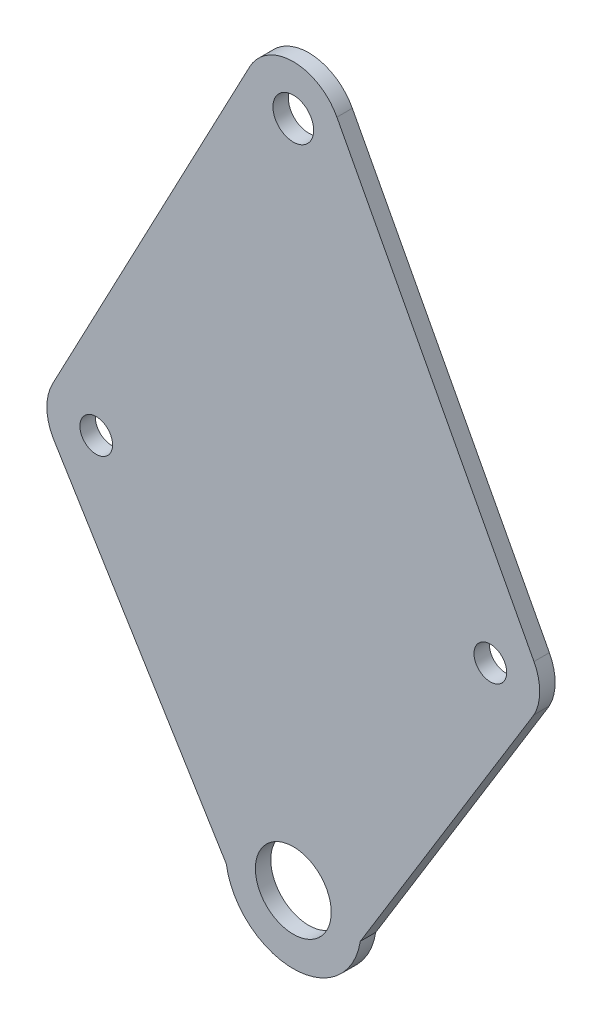
ISO-10303-21;
HEADER;
FILE_DESCRIPTION(('STEP AP214'),'2;1');
FILE_NAME('part.step','',(''),(''),'','','');
FILE_SCHEMA(('AUTOMOTIVE_DESIGN { 1 0 10303 214 1 1 1 1 }'));
ENDSEC;
DATA;
#1=APPLICATION_CONTEXT('core data for automotive mechanical design processes');
#2=APPLICATION_PROTOCOL_DEFINITION('international standard','automotive_design',2000,#1);
#3=PRODUCT_CONTEXT('',#1,'mechanical');
#4=PRODUCT('Part','Part','',(#3));
#5=PRODUCT_RELATED_PRODUCT_CATEGORY('part','',(#4));
#6=PRODUCT_DEFINITION_FORMATION('','',#4);
#7=PRODUCT_DEFINITION_CONTEXT('part definition',#1,'design');
#8=PRODUCT_DEFINITION('design','',#6,#7);
#9=PRODUCT_DEFINITION_SHAPE('','',#8);
#10=(LENGTH_UNIT() NAMED_UNIT(*) SI_UNIT(.MILLI.,.METRE.));
#11=(NAMED_UNIT(*) PLANE_ANGLE_UNIT() SI_UNIT($,.RADIAN.));
#12=(NAMED_UNIT(*) SI_UNIT($,.STERADIAN.) SOLID_ANGLE_UNIT());
#13=UNCERTAINTY_MEASURE_WITH_UNIT(LENGTH_MEASURE(1.E-05),#10,'distance_accuracy_value','');
#14=(GEOMETRIC_REPRESENTATION_CONTEXT(3) GLOBAL_UNCERTAINTY_ASSIGNED_CONTEXT((#13)) GLOBAL_UNIT_ASSIGNED_CONTEXT((#10,
#11,#12)) REPRESENTATION_CONTEXT('',''));
#15=CARTESIAN_POINT('',(0.,0.,0.));
#16=DIRECTION('',(0.,0.,1.));
#17=DIRECTION('',(1.,0.,0.));
#18=AXIS2_PLACEMENT_3D('',#15,#16,#17);
#19=CARTESIAN_POINT('',(65.848504693527,34.7933582987225,3.175));
#20=DIRECTION('',(0.884163052156837,0.467178442568475,0.));
#21=DIRECTION('',(-0.467178442568475,0.884163052156837,0.));
#22=AXIS2_PLACEMENT_3D('',#19,#20,#21);
#23=PLANE('',#22);
#24=DIRECTION('',(0.467178442568475,-0.884163052156838,0.));
#25=VECTOR('',#24,1.);
#26=CARTESIAN_POINT('',(65.848504693527,34.7933582987225,0.));
#27=LINE('',#26,#25);
#28=CARTESIAN_POINT('',(8.98309660991346,142.414532976496,0.));
#29=VERTEX_POINT('',#28);
#30=CARTESIAN_POINT('',(49.5659535589517,65.6090569617355,0.));
#31=VERTEX_POINT('',#30);
#32=EDGE_CURVE('E164',#29,#31,#27,.T.);
#33=ORIENTED_EDGE('',*,*,#32,.F.);
#34=DIRECTION('',(0.,0.,-1.));
#35=VECTOR('',#34,1.);
#36=CARTESIAN_POINT('',(8.98309660991346,142.414532976496,3.175));
#37=LINE('',#36,#35);
#38=CARTESIAN_POINT('',(8.98309660991346,142.414532976496,3.175));
#39=VERTEX_POINT('',#38);
#40=EDGE_CURVE('E11',#39,#29,#37,.T.);
#41=ORIENTED_EDGE('',*,*,#40,.F.);
#42=DIRECTION('',(0.467178442568475,-0.884163052156838,0.));
#43=VECTOR('',#42,1.);
#44=CARTESIAN_POINT('',(65.848504693527,34.7933582987225,3.175));
#45=LINE('',#44,#43);
#46=CARTESIAN_POINT('',(49.5659535589517,65.6090569617355,3.175));
#47=VERTEX_POINT('',#46);
#48=EDGE_CURVE('E205',#39,#47,#45,.T.);
#49=ORIENTED_EDGE('',*,*,#48,.T.);
#50=DIRECTION('',(0.,0.,-1.));
#51=VECTOR('',#50,1.);
#52=CARTESIAN_POINT('',(49.5659535589517,65.6090569617355,3.175));
#53=LINE('',#52,#51);
#54=EDGE_CURVE('E66',#47,#31,#53,.T.);
#55=ORIENTED_EDGE('',*,*,#54,.T.);
#56=EDGE_LOOP('',(#33,#41,#49,#55));
#57=FACE_BOUND('',#56,.T.);
#58=ADVANCED_FACE('F49',(#57),#23,.T.);
#59=CARTESIAN_POINT('',(0.,137.668,3.175));
#60=DIRECTION('',(0.,0.,-1.));
#61=DIRECTION('',(-1.,0.,0.));
#62=AXIS2_PLACEMENT_3D('',#59,#60,#61);
#63=CYLINDRICAL_SURFACE('',#62,10.16);
#64=CARTESIAN_POINT('',(0.,137.668,0.));
#65=DIRECTION('',(0.,0.,1.));
#66=DIRECTION('',(1.,0.,0.));
#67=AXIS2_PLACEMENT_3D('',#64,#65,#66);
#68=CIRCLE('',#67,10.16);
#69=CARTESIAN_POINT('',(-8.98309660991346,142.414532976496,0.));
#70=VERTEX_POINT('',#69);
#71=EDGE_CURVE('E167',#29,#70,#68,.T.);
#72=ORIENTED_EDGE('',*,*,#71,.T.);
#73=DIRECTION('',(0.,0.,-1.));
#74=VECTOR('',#73,1.);
#75=CARTESIAN_POINT('',(-8.98309660991346,142.414532976496,3.175));
#76=LINE('',#75,#74);
#77=CARTESIAN_POINT('',(-8.98309660991346,142.414532976496,3.175));
#78=VERTEX_POINT('',#77);
#79=EDGE_CURVE('E58',#78,#70,#76,.T.);
#80=ORIENTED_EDGE('',*,*,#79,.F.);
#81=CARTESIAN_POINT('',(0.,137.668,3.175));
#82=DIRECTION('',(0.,0.,1.));
#83=DIRECTION('',(1.,0.,0.));
#84=AXIS2_PLACEMENT_3D('',#81,#82,#83);
#85=CIRCLE('',#84,10.16);
#86=EDGE_CURVE('E248',#39,#78,#85,.T.);
#87=ORIENTED_EDGE('',*,*,#86,.F.);
#88=ORIENTED_EDGE('',*,*,#40,.T.);
#89=EDGE_LOOP('',(#72,#80,#87,#88));
#90=FACE_BOUND('',#89,.T.);
#91=ADVANCED_FACE('F268',(#90),#63,.T.);
#92=CARTESIAN_POINT('',(-65.848504693527,34.7933582987225,3.175));
#93=DIRECTION('',(0.884163052156837,-0.467178442568475,0.));
#94=DIRECTION('',(0.467178442568475,0.884163052156837,0.));
#95=AXIS2_PLACEMENT_3D('',#92,#93,#94);
#96=PLANE('',#95);
#97=DIRECTION('',(-0.467178442568475,-0.884163052156838,0.));
#98=VECTOR('',#97,1.);
#99=CARTESIAN_POINT('',(-65.848504693527,34.7933582987225,0.));
#100=LINE('',#99,#98);
#101=CARTESIAN_POINT('',(-49.5659535589517,65.6090569617355,0.));
#102=VERTEX_POINT('',#101);
#103=EDGE_CURVE('E170',#70,#102,#100,.T.);
#104=ORIENTED_EDGE('',*,*,#103,.T.);
#105=DIRECTION('',(0.,0.,-1.));
#106=VECTOR('',#105,1.);
#107=CARTESIAN_POINT('',(-49.5659535589517,65.6090569617355,3.175));
#108=LINE('',#107,#106);
#109=CARTESIAN_POINT('',(-49.5659535589517,65.6090569617355,3.175));
#110=VERTEX_POINT('',#109);
#111=EDGE_CURVE('E216',#110,#102,#108,.T.);
#112=ORIENTED_EDGE('',*,*,#111,.F.);
#113=DIRECTION('',(-0.467178442568475,-0.884163052156838,0.));
#114=VECTOR('',#113,1.);
#115=CARTESIAN_POINT('',(-65.848504693527,34.7933582987225,3.175));
#116=LINE('',#115,#114);
#117=EDGE_CURVE('E227',#78,#110,#116,.T.);
#118=ORIENTED_EDGE('',*,*,#117,.F.);
#119=ORIENTED_EDGE('',*,*,#79,.T.);
#120=EDGE_LOOP('',(#104,#112,#118,#119));
#121=FACE_BOUND('',#120,.T.);
#122=ADVANCED_FACE('F225',(#121),#96,.F.);
#123=CARTESIAN_POINT('',(-40.5828569490383,60.8625239852398,3.175));
#124=DIRECTION('',(0.,0.,-1.));
#125=DIRECTION('',(-1.,0.,0.));
#126=AXIS2_PLACEMENT_3D('',#123,#124,#125);
#127=CYLINDRICAL_SURFACE('',#126,10.16);
#128=CARTESIAN_POINT('',(-40.5828569490383,60.8625239852398,0.));
#129=DIRECTION('',(0.,0.,1.));
#130=DIRECTION('',(1.,0.,0.));
#131=AXIS2_PLACEMENT_3D('',#128,#129,#130);
#132=CIRCLE('',#131,10.16);
#133=CARTESIAN_POINT('',(-49.5659535589517,56.1159910087441,0.));
#134=VERTEX_POINT('',#133);
#135=EDGE_CURVE('E173',#102,#134,#132,.T.);
#136=ORIENTED_EDGE('',*,*,#135,.T.);
#137=DIRECTION('',(0.,0.,-1.));
#138=VECTOR('',#137,1.);
#139=CARTESIAN_POINT('',(-49.5659535589517,56.1159910087441,3.175));
#140=LINE('',#139,#138);
#141=CARTESIAN_POINT('',(-49.5659535589517,56.1159910087441,3.175));
#142=VERTEX_POINT('',#141);
#143=EDGE_CURVE('E212',#142,#134,#140,.T.);
#144=ORIENTED_EDGE('',*,*,#143,.F.);
#145=CARTESIAN_POINT('',(-40.5828569490383,60.8625239852398,3.175));
#146=DIRECTION('',(0.,0.,1.));
#147=DIRECTION('',(1.,0.,0.));
#148=AXIS2_PLACEMENT_3D('',#145,#146,#147);
#149=CIRCLE('',#148,10.16);
#150=EDGE_CURVE('E242',#110,#142,#149,.T.);
#151=ORIENTED_EDGE('',*,*,#150,.F.);
#152=ORIENTED_EDGE('',*,*,#111,.T.);
#153=EDGE_LOOP('',(#136,#144,#151,#152));
#154=FACE_BOUND('',#153,.T.);
#155=ADVANCED_FACE('F237',(#154),#127,.T.);
#156=CARTESIAN_POINT('',(-10.9897297062539,-6.74420823263941,3.175));
#157=DIRECTION('',(0.852305080484148,0.523044978735968,0.));
#158=DIRECTION('',(-0.523044978735968,0.852305080484148,0.));
#159=AXIS2_PLACEMENT_3D('',#156,#157,#158);
#160=PLANE('',#159);
#161=DIRECTION('',(0.523044978735968,-0.852305080484148,0.));
#162=VECTOR('',#161,1.);
#163=CARTESIAN_POINT('',(-10.9897297062539,-6.74420823263941,0.));
#164=LINE('',#163,#162);
#165=CARTESIAN_POINT('',(-13.8016691452329,-2.16213524219125,0.));
#166=VERTEX_POINT('',#165);
#167=EDGE_CURVE('E176',#134,#166,#164,.T.);
#168=ORIENTED_EDGE('',*,*,#167,.T.);
#169=DIRECTION('',(0.,0.,-1.));
#170=VECTOR('',#169,1.);
#171=CARTESIAN_POINT('',(-13.8016691452329,-2.16213524219125,3.175));
#172=LINE('',#171,#170);
#173=CARTESIAN_POINT('',(-13.8016691452329,-2.16213524219125,3.175));
#174=VERTEX_POINT('',#173);
#175=EDGE_CURVE('E126',#174,#166,#172,.T.);
#176=ORIENTED_EDGE('',*,*,#175,.F.);
#177=DIRECTION('',(0.523044978735968,-0.852305080484148,0.));
#178=VECTOR('',#177,1.);
#179=CARTESIAN_POINT('',(-10.9897297062539,-6.74420823263941,3.175));
#180=LINE('',#179,#178);
#181=EDGE_CURVE('E136',#142,#174,#180,.T.);
#182=ORIENTED_EDGE('',*,*,#181,.F.);
#183=ORIENTED_EDGE('',*,*,#143,.T.);
#184=EDGE_LOOP('',(#168,#176,#182,#183));
#185=FACE_BOUND('',#184,.T.);
#186=ADVANCED_FACE('F240',(#185),#160,.F.);
#187=CARTESIAN_POINT('',(0.,0.,3.175));
#188=DIRECTION('',(0.,0.,-1.));
#189=DIRECTION('',(-1.,0.,0.));
#190=AXIS2_PLACEMENT_3D('',#187,#188,#189);
#191=CYLINDRICAL_SURFACE('',#190,13.97);
#192=CARTESIAN_POINT('',(0.,0.,0.));
#193=DIRECTION('',(0.,0.,1.));
#194=DIRECTION('',(1.,0.,0.));
#195=AXIS2_PLACEMENT_3D('',#192,#193,#194);
#196=CIRCLE('',#195,13.97);
#197=CARTESIAN_POINT('',(13.8016691452329,-2.16213524219125,0.));
#198=VERTEX_POINT('',#197);
#199=EDGE_CURVE('E121',#198,#166,#196,.F.);
#200=ORIENTED_EDGE('',*,*,#199,.F.);
#201=DIRECTION('',(0.,0.,-1.));
#202=VECTOR('',#201,1.);
#203=CARTESIAN_POINT('',(13.8016691452329,-2.16213524219125,3.175));
#204=LINE('',#203,#202);
#205=CARTESIAN_POINT('',(13.8016691452329,-2.16213524219125,3.175));
#206=VERTEX_POINT('',#205);
#207=EDGE_CURVE('E116',#206,#198,#204,.T.);
#208=ORIENTED_EDGE('',*,*,#207,.F.);
#209=CARTESIAN_POINT('',(0.,0.,3.175));
#210=DIRECTION('',(0.,0.,1.));
#211=DIRECTION('',(1.,0.,0.));
#212=AXIS2_PLACEMENT_3D('',#209,#210,#211);
#213=CIRCLE('',#212,13.97);
#214=EDGE_CURVE('E119',#206,#174,#213,.F.);
#215=ORIENTED_EDGE('',*,*,#214,.T.);
#216=ORIENTED_EDGE('',*,*,#175,.T.);
#217=EDGE_LOOP('',(#200,#208,#215,#216));
#218=FACE_BOUND('',#217,.T.);
#219=ADVANCED_FACE('F118',(#218),#191,.T.);
#220=CARTESIAN_POINT('',(10.9897297062539,-6.74420823263941,3.175));
#221=DIRECTION('',(0.852305080484148,-0.523044978735968,0.));
#222=DIRECTION('',(0.523044978735968,0.852305080484148,0.));
#223=AXIS2_PLACEMENT_3D('',#220,#221,#222);
#224=PLANE('',#223);
#225=DIRECTION('',(-0.523044978735968,-0.852305080484148,0.));
#226=VECTOR('',#225,1.);
#227=CARTESIAN_POINT('',(10.9897297062539,-6.74420823263941,0.));
#228=LINE('',#227,#226);
#229=CARTESIAN_POINT('',(49.5659535589517,56.1159910087441,0.));
#230=VERTEX_POINT('',#229);
#231=EDGE_CURVE('E182',#230,#198,#228,.T.);
#232=ORIENTED_EDGE('',*,*,#231,.F.);
#233=DIRECTION('',(0.,0.,-1.));
#234=VECTOR('',#233,1.);
#235=CARTESIAN_POINT('',(49.5659535589517,56.1159910087441,3.175));
#236=LINE('',#235,#234);
#237=CARTESIAN_POINT('',(49.5659535589517,56.1159910087441,3.175));
#238=VERTEX_POINT('',#237);
#239=EDGE_CURVE('E91',#238,#230,#236,.T.);
#240=ORIENTED_EDGE('',*,*,#239,.F.);
#241=DIRECTION('',(-0.523044978735968,-0.852305080484148,0.));
#242=VECTOR('',#241,1.);
#243=CARTESIAN_POINT('',(10.9897297062539,-6.74420823263941,3.175));
#244=LINE('',#243,#242);
#245=EDGE_CURVE('E134',#238,#206,#244,.T.);
#246=ORIENTED_EDGE('',*,*,#245,.T.);
#247=ORIENTED_EDGE('',*,*,#207,.T.);
#248=EDGE_LOOP('',(#232,#240,#246,#247));
#249=FACE_BOUND('',#248,.T.);
#250=ADVANCED_FACE('F140',(#249),#224,.T.);
#251=CARTESIAN_POINT('',(40.5828569490383,60.8625239852398,3.175));
#252=DIRECTION('',(0.,0.,-1.));
#253=DIRECTION('',(-1.,0.,0.));
#254=AXIS2_PLACEMENT_3D('',#251,#252,#253);
#255=CYLINDRICAL_SURFACE('',#254,3.36549999999999);
#256=CARTESIAN_POINT('',(40.5828569490383,60.8625239852398,3.175));
#257=DIRECTION('',(0.,0.,1.));
#258=DIRECTION('',(1.,0.,0.));
#259=AXIS2_PLACEMENT_3D('',#256,#257,#258);
#260=CIRCLE('',#259,3.36549999999999);
#261=CARTESIAN_POINT('',(43.9483569490383,60.8625239852398,3.175));
#262=VERTEX_POINT('',#261);
#263=EDGE_CURVE('E156',#262,#262,#260,.T.);
#264=ORIENTED_EDGE('',*,*,#263,.T.);
#265=EDGE_LOOP('',(#264));
#266=FACE_BOUND('',#265,.T.);
#267=CARTESIAN_POINT('',(40.5828569490383,60.8625239852398,0.));
#268=DIRECTION('',(0.,0.,1.));
#269=DIRECTION('',(1.,0.,0.));
#270=AXIS2_PLACEMENT_3D('',#267,#268,#269);
#271=CIRCLE('',#270,3.36549999999999);
#272=CARTESIAN_POINT('',(43.9483569490383,60.8625239852398,0.));
#273=VERTEX_POINT('',#272);
#274=EDGE_CURVE('E197',#273,#273,#271,.T.);
#275=ORIENTED_EDGE('',*,*,#274,.F.);
#276=EDGE_LOOP('',(#275));
#277=FACE_BOUND('',#276,.T.);
#278=ADVANCED_FACE('F283',(#266,#277),#255,.F.);
#279=CARTESIAN_POINT('',(0.,137.668,3.175));
#280=DIRECTION('',(0.,0.,-1.));
#281=DIRECTION('',(-1.,0.,0.));
#282=AXIS2_PLACEMENT_3D('',#279,#280,#281);
#283=CYLINDRICAL_SURFACE('',#282,4.191);
#284=CARTESIAN_POINT('',(0.,137.668,3.175));
#285=DIRECTION('',(0.,0.,1.));
#286=DIRECTION('',(1.,0.,0.));
#287=AXIS2_PLACEMENT_3D('',#284,#285,#286);
#288=CIRCLE('',#287,4.191);
#289=CARTESIAN_POINT('',(4.191,137.668,3.175));
#290=VERTEX_POINT('',#289);
#291=EDGE_CURVE('E152',#290,#290,#288,.T.);
#292=ORIENTED_EDGE('',*,*,#291,.T.);
#293=EDGE_LOOP('',(#292));
#294=FACE_BOUND('',#293,.T.);
#295=CARTESIAN_POINT('',(0.,137.668,0.));
#296=DIRECTION('',(0.,0.,1.));
#297=DIRECTION('',(1.,0.,0.));
#298=AXIS2_PLACEMENT_3D('',#295,#296,#297);
#299=CIRCLE('',#298,4.191);
#300=CARTESIAN_POINT('',(4.191,137.668,0.));
#301=VERTEX_POINT('',#300);
#302=EDGE_CURVE('E193',#301,#301,#299,.T.);
#303=ORIENTED_EDGE('',*,*,#302,.F.);
#304=EDGE_LOOP('',(#303));
#305=FACE_BOUND('',#304,.T.);
#306=ADVANCED_FACE('F263',(#294,#305),#283,.F.);
#307=CARTESIAN_POINT('',(-40.5828569490383,60.8625239852398,3.175));
#308=DIRECTION('',(0.,0.,-1.));
#309=DIRECTION('',(-1.,0.,0.));
#310=AXIS2_PLACEMENT_3D('',#307,#308,#309);
#311=CYLINDRICAL_SURFACE('',#310,3.36549999999999);
#312=CARTESIAN_POINT('',(-40.5828569490383,60.8625239852398,3.175));
#313=DIRECTION('',(0.,0.,1.));
#314=DIRECTION('',(1.,0.,0.));
#315=AXIS2_PLACEMENT_3D('',#312,#313,#314);
#316=CIRCLE('',#315,3.36549999999999);
#317=CARTESIAN_POINT('',(-37.2173569490383,60.8625239852398,3.175));
#318=VERTEX_POINT('',#317);
#319=EDGE_CURVE('E145',#318,#318,#316,.F.);
#320=ORIENTED_EDGE('',*,*,#319,.F.);
#321=EDGE_LOOP('',(#320));
#322=FACE_BOUND('',#321,.T.);
#323=CARTESIAN_POINT('',(-40.5828569490383,60.8625239852398,0.));
#324=DIRECTION('',(0.,0.,1.));
#325=DIRECTION('',(1.,0.,0.));
#326=AXIS2_PLACEMENT_3D('',#323,#324,#325);
#327=CIRCLE('',#326,3.36549999999999);
#328=CARTESIAN_POINT('',(-37.2173569490383,60.8625239852398,0.));
#329=VERTEX_POINT('',#328);
#330=EDGE_CURVE('E189',#329,#329,#327,.F.);
#331=ORIENTED_EDGE('',*,*,#330,.T.);
#332=EDGE_LOOP('',(#331));
#333=FACE_BOUND('',#332,.T.);
#334=ADVANCED_FACE('F255',(#322,#333),#311,.F.);
#335=CARTESIAN_POINT('',(40.5828569490383,60.8625239852398,3.175));
#336=DIRECTION('',(0.,0.,-1.));
#337=DIRECTION('',(-1.,0.,0.));
#338=AXIS2_PLACEMENT_3D('',#335,#336,#337);
#339=CYLINDRICAL_SURFACE('',#338,10.16);
#340=CARTESIAN_POINT('',(40.5828569490383,60.8625239852398,0.));
#341=DIRECTION('',(0.,0.,1.));
#342=DIRECTION('',(1.,0.,0.));
#343=AXIS2_PLACEMENT_3D('',#340,#341,#342);
#344=CIRCLE('',#343,10.16);
#345=EDGE_CURVE('E185',#31,#230,#344,.F.);
#346=ORIENTED_EDGE('',*,*,#345,.F.);
#347=ORIENTED_EDGE('',*,*,#54,.F.);
#348=CARTESIAN_POINT('',(40.5828569490383,60.8625239852398,3.175));
#349=DIRECTION('',(0.,0.,1.));
#350=DIRECTION('',(1.,0.,0.));
#351=AXIS2_PLACEMENT_3D('',#348,#349,#350);
#352=CIRCLE('',#351,10.16);
#353=EDGE_CURVE('E142',#47,#238,#352,.F.);
#354=ORIENTED_EDGE('',*,*,#353,.T.);
#355=ORIENTED_EDGE('',*,*,#239,.T.);
#356=EDGE_LOOP('',(#346,#347,#354,#355));
#357=FACE_BOUND('',#356,.T.);
#358=ADVANCED_FACE('F252',(#357),#339,.T.);
#359=CARTESIAN_POINT('',(0.,0.,3.175));
#360=DIRECTION('',(0.,0.,-1.));
#361=DIRECTION('',(-1.,0.,0.));
#362=AXIS2_PLACEMENT_3D('',#359,#360,#361);
#363=CYLINDRICAL_SURFACE('',#362,7.8105);
#364=CARTESIAN_POINT('',(0.,0.,3.175));
#365=DIRECTION('',(0.,0.,1.));
#366=DIRECTION('',(1.,0.,0.));
#367=AXIS2_PLACEMENT_3D('',#364,#365,#366);
#368=CIRCLE('',#367,7.8105);
#369=CARTESIAN_POINT('',(7.8105,0.,3.175));
#370=VERTEX_POINT('',#369);
#371=EDGE_CURVE('E160',#370,#370,#368,.T.);
#372=ORIENTED_EDGE('',*,*,#371,.T.);
#373=EDGE_LOOP('',(#372));
#374=FACE_BOUND('',#373,.T.);
#375=CARTESIAN_POINT('',(0.,0.,0.));
#376=DIRECTION('',(0.,0.,1.));
#377=DIRECTION('',(1.,0.,0.));
#378=AXIS2_PLACEMENT_3D('',#375,#376,#377);
#379=CIRCLE('',#378,7.8105);
#380=CARTESIAN_POINT('',(7.8105,0.,0.));
#381=VERTEX_POINT('',#380);
#382=EDGE_CURVE('E201',#381,#381,#379,.T.);
#383=ORIENTED_EDGE('',*,*,#382,.F.);
#384=EDGE_LOOP('',(#383));
#385=FACE_BOUND('',#384,.T.);
#386=ADVANCED_FACE('F254',(#374,#385),#363,.F.);
#387=CARTESIAN_POINT('',(0.,0.,3.175));
#388=DIRECTION('',(0.,0.,1.));
#389=DIRECTION('',(1.,0.,0.));
#390=AXIS2_PLACEMENT_3D('',#387,#388,#389);
#391=PLANE('',#390);
#392=ORIENTED_EDGE('',*,*,#48,.F.);
#393=ORIENTED_EDGE('',*,*,#86,.T.);
#394=ORIENTED_EDGE('',*,*,#117,.T.);
#395=ORIENTED_EDGE('',*,*,#150,.T.);
#396=ORIENTED_EDGE('',*,*,#181,.T.);
#397=ORIENTED_EDGE('',*,*,#214,.F.);
#398=ORIENTED_EDGE('',*,*,#245,.F.);
#399=ORIENTED_EDGE('',*,*,#353,.F.);
#400=EDGE_LOOP('',(#392,#393,#394,#395,#396,#397,#398,#399));
#401=FACE_BOUND('',#400,.T.);
#402=ORIENTED_EDGE('',*,*,#319,.T.);
#403=EDGE_LOOP('',(#402));
#404=FACE_BOUND('',#403,.T.);
#405=ORIENTED_EDGE('',*,*,#291,.F.);
#406=EDGE_LOOP('',(#405));
#407=FACE_BOUND('',#406,.T.);
#408=ORIENTED_EDGE('',*,*,#263,.F.);
#409=EDGE_LOOP('',(#408));
#410=FACE_BOUND('',#409,.T.);
#411=ORIENTED_EDGE('',*,*,#371,.F.);
#412=EDGE_LOOP('',(#411));
#413=FACE_BOUND('',#412,.T.);
#414=ADVANCED_FACE('F131',(#401,#404,#407,#410,#413),#391,.T.);
#415=CARTESIAN_POINT('',(0.,0.,0.));
#416=DIRECTION('',(0.,0.,1.));
#417=DIRECTION('',(1.,0.,0.));
#418=AXIS2_PLACEMENT_3D('',#415,#416,#417);
#419=PLANE('',#418);
#420=ORIENTED_EDGE('',*,*,#32,.T.);
#421=ORIENTED_EDGE('',*,*,#345,.T.);
#422=ORIENTED_EDGE('',*,*,#231,.T.);
#423=ORIENTED_EDGE('',*,*,#199,.T.);
#424=ORIENTED_EDGE('',*,*,#167,.F.);
#425=ORIENTED_EDGE('',*,*,#135,.F.);
#426=ORIENTED_EDGE('',*,*,#103,.F.);
#427=ORIENTED_EDGE('',*,*,#71,.F.);
#428=EDGE_LOOP('',(#420,#421,#422,#423,#424,#425,#426,#427));
#429=FACE_BOUND('',#428,.T.);
#430=ORIENTED_EDGE('',*,*,#330,.F.);
#431=EDGE_LOOP('',(#430));
#432=FACE_BOUND('',#431,.T.);
#433=ORIENTED_EDGE('',*,*,#302,.T.);
#434=EDGE_LOOP('',(#433));
#435=FACE_BOUND('',#434,.T.);
#436=ORIENTED_EDGE('',*,*,#274,.T.);
#437=EDGE_LOOP('',(#436));
#438=FACE_BOUND('',#437,.T.);
#439=ORIENTED_EDGE('',*,*,#382,.T.);
#440=EDGE_LOOP('',(#439));
#441=FACE_BOUND('',#440,.T.);
#442=ADVANCED_FACE('F232',(#429,#432,#435,#438,#441),#419,.F.);
#443=CLOSED_SHELL('',(#58,#91,#122,#155,#186,#219,#250,#278,#306,#334,#358,#386,#414,#442));
#444=MANIFOLD_SOLID_BREP('B2',#443);
#445=ADVANCED_BREP_SHAPE_REPRESENTATION('',(#18,#444),#14);
#446=SHAPE_DEFINITION_REPRESENTATION(#9,#445);
ENDSEC;
END-ISO-10303-21;
